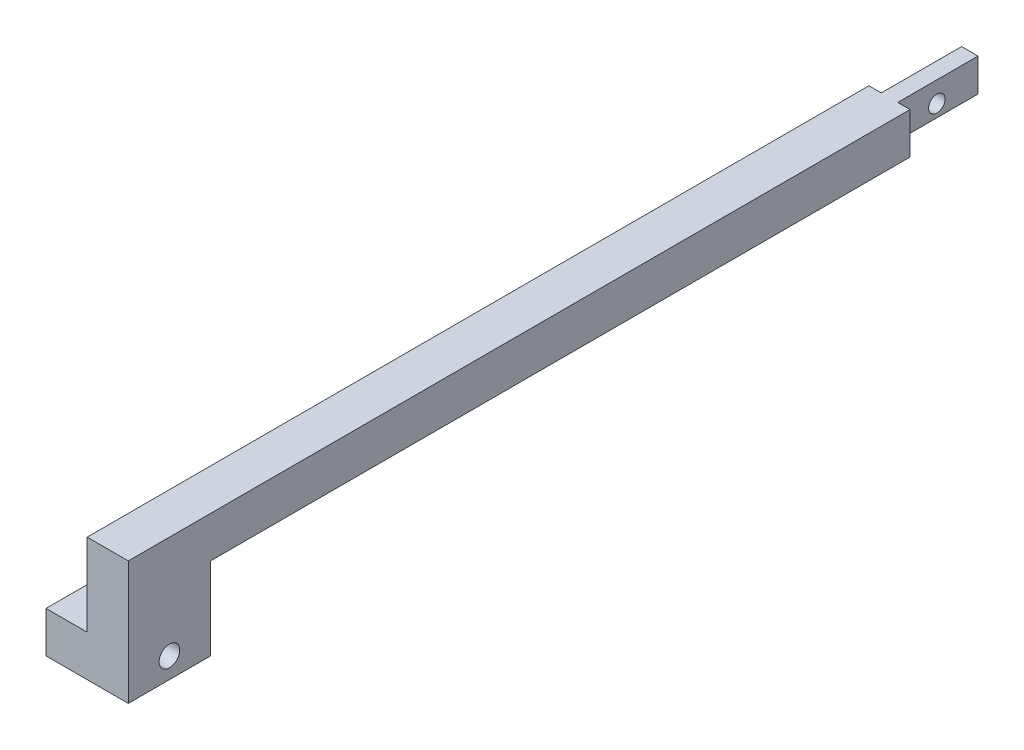
ISO-10303-21;
HEADER;
FILE_DESCRIPTION(('STEP AP214'),'2;1');
FILE_NAME('part.step','',(''),(''),'','','');
FILE_SCHEMA(('AUTOMOTIVE_DESIGN { 1 0 10303 214 1 1 1 1 }'));
ENDSEC;
DATA;
#1=APPLICATION_CONTEXT('core data for automotive mechanical design processes');
#2=APPLICATION_PROTOCOL_DEFINITION('international standard','automotive_design',2000,#1);
#3=PRODUCT_CONTEXT('',#1,'mechanical');
#4=PRODUCT('Part','Part','',(#3));
#5=PRODUCT_RELATED_PRODUCT_CATEGORY('part','',(#4));
#6=PRODUCT_DEFINITION_FORMATION('','',#4);
#7=PRODUCT_DEFINITION_CONTEXT('part definition',#1,'design');
#8=PRODUCT_DEFINITION('design','',#6,#7);
#9=PRODUCT_DEFINITION_SHAPE('','',#8);
#10=(LENGTH_UNIT() NAMED_UNIT(*) SI_UNIT(.MILLI.,.METRE.));
#11=(NAMED_UNIT(*) PLANE_ANGLE_UNIT() SI_UNIT($,.RADIAN.));
#12=(NAMED_UNIT(*) SI_UNIT($,.STERADIAN.) SOLID_ANGLE_UNIT());
#13=UNCERTAINTY_MEASURE_WITH_UNIT(LENGTH_MEASURE(1.E-05),#10,'distance_accuracy_value','');
#14=(GEOMETRIC_REPRESENTATION_CONTEXT(3) GLOBAL_UNCERTAINTY_ASSIGNED_CONTEXT((#13)) GLOBAL_UNIT_ASSIGNED_CONTEXT((#10,
#11,#12)) REPRESENTATION_CONTEXT('',''));
#15=CARTESIAN_POINT('',(0.,0.,0.));
#16=DIRECTION('',(0.,0.,1.));
#17=DIRECTION('',(1.,0.,0.));
#18=AXIS2_PLACEMENT_3D('',#15,#16,#17);
#19=CARTESIAN_POINT('',(0.,0.,0.));
#20=DIRECTION('',(0.,0.,-1.));
#21=DIRECTION('',(-1.,0.,0.));
#22=AXIS2_PLACEMENT_3D('',#19,#20,#21);
#23=PLANE('',#22);
#24=DIRECTION('',(0.,1.,0.));
#25=VECTOR('',#24,1.);
#26=CARTESIAN_POINT('',(13.,30.,0.));
#27=LINE('',#26,#25);
#28=CARTESIAN_POINT('',(13.,22.,0.));
#29=VERTEX_POINT('',#28);
#30=CARTESIAN_POINT('',(13.,30.,0.));
#31=VERTEX_POINT('',#30);
#32=EDGE_CURVE('E161',#29,#31,#27,.T.);
#33=ORIENTED_EDGE('',*,*,#32,.F.);
#34=DIRECTION('',(-1.,0.,0.));
#35=VECTOR('',#34,1.);
#36=CARTESIAN_POINT('',(13.,22.,0.));
#37=LINE('',#36,#35);
#38=CARTESIAN_POINT('',(17.,22.,0.));
#39=VERTEX_POINT('',#38);
#40=EDGE_CURVE('E151',#39,#29,#37,.T.);
#41=ORIENTED_EDGE('',*,*,#40,.F.);
#42=DIRECTION('',(0.,-1.,0.));
#43=VECTOR('',#42,1.);
#44=CARTESIAN_POINT('',(17.,30.,0.));
#45=LINE('',#44,#43);
#46=CARTESIAN_POINT('',(17.,30.,0.));
#47=VERTEX_POINT('',#46);
#48=EDGE_CURVE('E61',#47,#39,#45,.T.);
#49=ORIENTED_EDGE('',*,*,#48,.F.);
#50=DIRECTION('',(-1.,0.,0.));
#51=VECTOR('',#50,1.);
#52=CARTESIAN_POINT('',(10.,30.,0.));
#53=LINE('',#52,#51);
#54=CARTESIAN_POINT('',(20.,30.,0.));
#55=VERTEX_POINT('',#54);
#56=EDGE_CURVE('E206',#55,#47,#53,.T.);
#57=ORIENTED_EDGE('',*,*,#56,.F.);
#58=DIRECTION('',(0.,1.,0.));
#59=VECTOR('',#58,1.);
#60=CARTESIAN_POINT('',(20.,30.,0.));
#61=LINE('',#60,#59);
#62=CARTESIAN_POINT('',(20.,20.,0.));
#63=VERTEX_POINT('',#62);
#64=EDGE_CURVE('E189',#63,#55,#61,.T.);
#65=ORIENTED_EDGE('',*,*,#64,.F.);
#66=DIRECTION('',(1.,0.,0.));
#67=VECTOR('',#66,1.);
#68=CARTESIAN_POINT('',(0.,20.,0.));
#69=LINE('',#68,#67);
#70=CARTESIAN_POINT('',(10.,20.,0.));
#71=VERTEX_POINT('',#70);
#72=EDGE_CURVE('E47',#71,#63,#69,.T.);
#73=ORIENTED_EDGE('',*,*,#72,.F.);
#74=DIRECTION('',(0.,-1.,0.));
#75=VECTOR('',#74,1.);
#76=CARTESIAN_POINT('',(10.,10.,0.));
#77=LINE('',#76,#75);
#78=CARTESIAN_POINT('',(10.,30.,0.));
#79=VERTEX_POINT('',#78);
#80=EDGE_CURVE('E194',#79,#71,#77,.T.);
#81=ORIENTED_EDGE('',*,*,#80,.F.);
#82=EDGE_CURVE('E54',#31,#79,#53,.T.);
#83=ORIENTED_EDGE('',*,*,#82,.F.);
#84=EDGE_LOOP('',(#33,#41,#49,#57,#65,#73,#81,#83));
#85=FACE_BOUND('',#84,.T.);
#86=ADVANCED_FACE('F39',(#85),#23,.T.);
#87=CARTESIAN_POINT('',(20.,0.,190.));
#88=DIRECTION('',(0.,1.,0.));
#89=DIRECTION('',(-1.,0.,0.));
#90=AXIS2_PLACEMENT_3D('',#87,#88,#89);
#91=PLANE('',#90);
#92=DIRECTION('',(0.,0.,-1.));
#93=VECTOR('',#92,1.);
#94=CARTESIAN_POINT('',(0.,0.,190.));
#95=LINE('',#94,#93);
#96=CARTESIAN_POINT('',(0.,0.,190.));
#97=VERTEX_POINT('',#96);
#98=CARTESIAN_POINT('',(0.,0.,170.));
#99=VERTEX_POINT('',#98);
#100=EDGE_CURVE('E204',#97,#99,#95,.T.);
#101=ORIENTED_EDGE('',*,*,#100,.T.);
#102=DIRECTION('',(1.,0.,0.));
#103=VECTOR('',#102,1.);
#104=CARTESIAN_POINT('',(-170.,0.,170.));
#105=LINE('',#104,#103);
#106=CARTESIAN_POINT('',(20.,0.,170.));
#107=VERTEX_POINT('',#106);
#108=EDGE_CURVE('E175',#99,#107,#105,.T.);
#109=ORIENTED_EDGE('',*,*,#108,.T.);
#110=DIRECTION('',(0.,0.,-1.));
#111=VECTOR('',#110,1.);
#112=CARTESIAN_POINT('',(20.,0.,190.));
#113=LINE('',#112,#111);
#114=CARTESIAN_POINT('',(20.,0.,190.));
#115=VERTEX_POINT('',#114);
#116=EDGE_CURVE('E224',#115,#107,#113,.T.);
#117=ORIENTED_EDGE('',*,*,#116,.F.);
#118=DIRECTION('',(1.,0.,0.));
#119=VECTOR('',#118,1.);
#120=CARTESIAN_POINT('',(20.,0.,190.));
#121=LINE('',#120,#119);
#122=EDGE_CURVE('E190',#97,#115,#121,.T.);
#123=ORIENTED_EDGE('',*,*,#122,.F.);
#124=EDGE_LOOP('',(#101,#109,#117,#123));
#125=FACE_BOUND('',#124,.T.);
#126=ADVANCED_FACE('F41',(#125),#91,.F.);
#127=CARTESIAN_POINT('',(20.,30.,190.));
#128=DIRECTION('',(-1.,0.,0.));
#129=DIRECTION('',(0.,-1.,0.));
#130=AXIS2_PLACEMENT_3D('',#127,#128,#129);
#131=PLANE('',#130);
#132=CARTESIAN_POINT('',(20.,5.,180.));
#133=DIRECTION('',(-1.,0.,0.));
#134=DIRECTION('',(0.,0.,1.));
#135=AXIS2_PLACEMENT_3D('',#132,#133,#134);
#136=CIRCLE('',#135,2.49999999999999);
#137=CARTESIAN_POINT('',(20.,5.,182.5));
#138=VERTEX_POINT('',#137);
#139=EDGE_CURVE('E155',#138,#138,#136,.T.);
#140=ORIENTED_EDGE('',*,*,#139,.T.);
#141=EDGE_LOOP('',(#140));
#142=FACE_BOUND('',#141,.T.);
#143=ORIENTED_EDGE('',*,*,#116,.T.);
#144=DIRECTION('',(0.,-1.,0.));
#145=VECTOR('',#144,1.);
#146=CARTESIAN_POINT('',(20.,20.,170.));
#147=LINE('',#146,#145);
#148=CARTESIAN_POINT('',(20.,20.,170.));
#149=VERTEX_POINT('',#148);
#150=EDGE_CURVE('E170',#149,#107,#147,.T.);
#151=ORIENTED_EDGE('',*,*,#150,.F.);
#152=DIRECTION('',(0.,0.,1.));
#153=VECTOR('',#152,1.);
#154=CARTESIAN_POINT('',(20.,20.,170.));
#155=LINE('',#154,#153);
#156=EDGE_CURVE('E172',#63,#149,#155,.T.);
#157=ORIENTED_EDGE('',*,*,#156,.F.);
#158=ORIENTED_EDGE('',*,*,#64,.T.);
#159=DIRECTION('',(0.,0.,-1.));
#160=VECTOR('',#159,1.);
#161=CARTESIAN_POINT('',(20.,30.,190.));
#162=LINE('',#161,#160);
#163=CARTESIAN_POINT('',(20.,30.,190.));
#164=VERTEX_POINT('',#163);
#165=EDGE_CURVE('E221',#164,#55,#162,.T.);
#166=ORIENTED_EDGE('',*,*,#165,.F.);
#167=DIRECTION('',(0.,1.,0.));
#168=VECTOR('',#167,1.);
#169=CARTESIAN_POINT('',(20.,30.,190.));
#170=LINE('',#169,#168);
#171=EDGE_CURVE('E193',#115,#164,#170,.T.);
#172=ORIENTED_EDGE('',*,*,#171,.F.);
#173=EDGE_LOOP('',(#143,#151,#157,#158,#166,#172));
#174=FACE_BOUND('',#173,.T.);
#175=ADVANCED_FACE('F234',(#142,#174),#131,.F.);
#176=CARTESIAN_POINT('',(10.,30.,190.));
#177=DIRECTION('',(0.,-1.,0.));
#178=DIRECTION('',(0.,0.,-1.));
#179=AXIS2_PLACEMENT_3D('',#176,#177,#178);
#180=PLANE('',#179);
#181=ORIENTED_EDGE('',*,*,#56,.T.);
#182=DIRECTION('',(0.,0.,1.));
#183=VECTOR('',#182,1.);
#184=CARTESIAN_POINT('',(17.,30.,-19.5));
#185=LINE('',#184,#183);
#186=CARTESIAN_POINT('',(17.,30.,-19.5));
#187=VERTEX_POINT('',#186);
#188=EDGE_CURVE('E164',#187,#47,#185,.T.);
#189=ORIENTED_EDGE('',*,*,#188,.F.);
#190=DIRECTION('',(1.,0.,0.));
#191=VECTOR('',#190,1.);
#192=CARTESIAN_POINT('',(17.,30.,-19.5));
#193=LINE('',#192,#191);
#194=CARTESIAN_POINT('',(13.,30.,-19.5));
#195=VERTEX_POINT('',#194);
#196=EDGE_CURVE('E137',#195,#187,#193,.T.);
#197=ORIENTED_EDGE('',*,*,#196,.F.);
#198=DIRECTION('',(0.,0.,1.));
#199=VECTOR('',#198,1.);
#200=CARTESIAN_POINT('',(13.,30.,-19.5));
#201=LINE('',#200,#199);
#202=EDGE_CURVE('E134',#195,#31,#201,.T.);
#203=ORIENTED_EDGE('',*,*,#202,.T.);
#204=ORIENTED_EDGE('',*,*,#82,.T.);
#205=DIRECTION('',(0.,0.,-1.));
#206=VECTOR('',#205,1.);
#207=CARTESIAN_POINT('',(10.,30.,190.));
#208=LINE('',#207,#206);
#209=CARTESIAN_POINT('',(10.,30.,190.));
#210=VERTEX_POINT('',#209);
#211=EDGE_CURVE('E218',#210,#79,#208,.T.);
#212=ORIENTED_EDGE('',*,*,#211,.F.);
#213=DIRECTION('',(-1.,0.,0.));
#214=VECTOR('',#213,1.);
#215=CARTESIAN_POINT('',(10.,30.,190.));
#216=LINE('',#215,#214);
#217=EDGE_CURVE('E196',#164,#210,#216,.T.);
#218=ORIENTED_EDGE('',*,*,#217,.F.);
#219=ORIENTED_EDGE('',*,*,#165,.T.);
#220=EDGE_LOOP('',(#181,#189,#197,#203,#204,#212,#218,#219));
#221=FACE_BOUND('',#220,.T.);
#222=ADVANCED_FACE('F238',(#221),#180,.F.);
#223=CARTESIAN_POINT('',(10.,10.,190.));
#224=DIRECTION('',(1.,0.,0.));
#225=DIRECTION('',(0.,0.,-1.));
#226=AXIS2_PLACEMENT_3D('',#223,#224,#225);
#227=PLANE('',#226);
#228=DIRECTION('',(0.,0.,1.));
#229=VECTOR('',#228,1.);
#230=CARTESIAN_POINT('',(10.,20.,190.));
#231=LINE('',#230,#229);
#232=CARTESIAN_POINT('',(10.,20.,170.));
#233=VERTEX_POINT('',#232);
#234=EDGE_CURVE('E178',#71,#233,#231,.T.);
#235=ORIENTED_EDGE('',*,*,#234,.T.);
#236=DIRECTION('',(0.,-1.,0.));
#237=VECTOR('',#236,1.);
#238=CARTESIAN_POINT('',(10.,10.,170.));
#239=LINE('',#238,#237);
#240=CARTESIAN_POINT('',(10.,10.,170.));
#241=VERTEX_POINT('',#240);
#242=EDGE_CURVE('E186',#233,#241,#239,.T.);
#243=ORIENTED_EDGE('',*,*,#242,.T.);
#244=DIRECTION('',(0.,0.,-1.));
#245=VECTOR('',#244,1.);
#246=CARTESIAN_POINT('',(10.,10.,190.));
#247=LINE('',#246,#245);
#248=CARTESIAN_POINT('',(10.,10.,190.));
#249=VERTEX_POINT('',#248);
#250=EDGE_CURVE('E215',#249,#241,#247,.T.);
#251=ORIENTED_EDGE('',*,*,#250,.F.);
#252=DIRECTION('',(0.,-1.,0.));
#253=VECTOR('',#252,1.);
#254=CARTESIAN_POINT('',(10.,10.,190.));
#255=LINE('',#254,#253);
#256=EDGE_CURVE('E198',#210,#249,#255,.T.);
#257=ORIENTED_EDGE('',*,*,#256,.F.);
#258=ORIENTED_EDGE('',*,*,#211,.T.);
#259=ORIENTED_EDGE('',*,*,#80,.T.);
#260=EDGE_LOOP('',(#235,#243,#251,#257,#258,#259));
#261=FACE_BOUND('',#260,.T.);
#262=ADVANCED_FACE('F245',(#261),#227,.F.);
#263=CARTESIAN_POINT('',(0.,10.,190.));
#264=DIRECTION('',(0.,-1.,0.));
#265=DIRECTION('',(0.,0.,-1.));
#266=AXIS2_PLACEMENT_3D('',#263,#264,#265);
#267=PLANE('',#266);
#268=ORIENTED_EDGE('',*,*,#250,.T.);
#269=DIRECTION('',(-1.,0.,0.));
#270=VECTOR('',#269,1.);
#271=CARTESIAN_POINT('',(0.,10.,170.));
#272=LINE('',#271,#270);
#273=CARTESIAN_POINT('',(0.,10.,170.));
#274=VERTEX_POINT('',#273);
#275=EDGE_CURVE('E183',#241,#274,#272,.T.);
#276=ORIENTED_EDGE('',*,*,#275,.T.);
#277=DIRECTION('',(0.,0.,-1.));
#278=VECTOR('',#277,1.);
#279=CARTESIAN_POINT('',(0.,10.,190.));
#280=LINE('',#279,#278);
#281=CARTESIAN_POINT('',(0.,10.,190.));
#282=VERTEX_POINT('',#281);
#283=EDGE_CURVE('E212',#282,#274,#280,.T.);
#284=ORIENTED_EDGE('',*,*,#283,.F.);
#285=DIRECTION('',(-1.,0.,0.));
#286=VECTOR('',#285,1.);
#287=CARTESIAN_POINT('',(0.,10.,190.));
#288=LINE('',#287,#286);
#289=EDGE_CURVE('E200',#249,#282,#288,.T.);
#290=ORIENTED_EDGE('',*,*,#289,.F.);
#291=EDGE_LOOP('',(#268,#276,#284,#290));
#292=FACE_BOUND('',#291,.T.);
#293=ADVANCED_FACE('F262',(#292),#267,.F.);
#294=CARTESIAN_POINT('',(0.,0.,190.));
#295=DIRECTION('',(1.,0.,0.));
#296=DIRECTION('',(0.,0.,-1.));
#297=AXIS2_PLACEMENT_3D('',#294,#295,#296);
#298=PLANE('',#297);
#299=ORIENTED_EDGE('',*,*,#283,.T.);
#300=DIRECTION('',(0.,-1.,0.));
#301=VECTOR('',#300,1.);
#302=CARTESIAN_POINT('',(0.,0.,170.));
#303=LINE('',#302,#301);
#304=EDGE_CURVE('E11',#274,#99,#303,.T.);
#305=ORIENTED_EDGE('',*,*,#304,.T.);
#306=ORIENTED_EDGE('',*,*,#100,.F.);
#307=DIRECTION('',(0.,-1.,0.));
#308=VECTOR('',#307,1.);
#309=CARTESIAN_POINT('',(0.,0.,190.));
#310=LINE('',#309,#308);
#311=EDGE_CURVE('E202',#282,#97,#310,.T.);
#312=ORIENTED_EDGE('',*,*,#311,.F.);
#313=EDGE_LOOP('',(#299,#305,#306,#312));
#314=FACE_BOUND('',#313,.T.);
#315=CARTESIAN_POINT('',(0.,5.,180.));
#316=DIRECTION('',(-1.,0.,0.));
#317=DIRECTION('',(0.,0.,1.));
#318=AXIS2_PLACEMENT_3D('',#315,#316,#317);
#319=CIRCLE('',#318,2.5);
#320=CARTESIAN_POINT('',(0.,5.,182.5));
#321=VERTEX_POINT('',#320);
#322=EDGE_CURVE('E152',#321,#321,#319,.T.);
#323=ORIENTED_EDGE('',*,*,#322,.F.);
#324=EDGE_LOOP('',(#323));
#325=FACE_BOUND('',#324,.T.);
#326=ADVANCED_FACE('F258',(#314,#325),#298,.F.);
#327=CARTESIAN_POINT('',(0.,0.,190.));
#328=DIRECTION('',(0.,0.,-1.));
#329=DIRECTION('',(-1.,0.,0.));
#330=AXIS2_PLACEMENT_3D('',#327,#328,#329);
#331=PLANE('',#330);
#332=ORIENTED_EDGE('',*,*,#122,.T.);
#333=ORIENTED_EDGE('',*,*,#171,.T.);
#334=ORIENTED_EDGE('',*,*,#217,.T.);
#335=ORIENTED_EDGE('',*,*,#256,.T.);
#336=ORIENTED_EDGE('',*,*,#289,.T.);
#337=ORIENTED_EDGE('',*,*,#311,.T.);
#338=EDGE_LOOP('',(#332,#333,#334,#335,#336,#337));
#339=FACE_BOUND('',#338,.T.);
#340=ADVANCED_FACE('F249',(#339),#331,.F.);
#341=CARTESIAN_POINT('',(-170.,20.,170.));
#342=DIRECTION('',(0.,0.,1.));
#343=DIRECTION('',(1.,0.,0.));
#344=AXIS2_PLACEMENT_3D('',#341,#342,#343);
#345=PLANE('',#344);
#346=DIRECTION('',(1.,0.,0.));
#347=VECTOR('',#346,1.);
#348=CARTESIAN_POINT('',(-170.,20.,170.));
#349=LINE('',#348,#347);
#350=EDGE_CURVE('E176',#233,#149,#349,.T.);
#351=ORIENTED_EDGE('',*,*,#350,.T.);
#352=ORIENTED_EDGE('',*,*,#150,.T.);
#353=ORIENTED_EDGE('',*,*,#108,.F.);
#354=ORIENTED_EDGE('',*,*,#304,.F.);
#355=ORIENTED_EDGE('',*,*,#275,.F.);
#356=ORIENTED_EDGE('',*,*,#242,.F.);
#357=EDGE_LOOP('',(#351,#352,#353,#354,#355,#356));
#358=FACE_BOUND('',#357,.T.);
#359=ADVANCED_FACE('F256',(#358),#345,.F.);
#360=CARTESIAN_POINT('',(-170.,20.,170.));
#361=DIRECTION('',(0.,1.,0.));
#362=DIRECTION('',(-1.,0.,0.));
#363=AXIS2_PLACEMENT_3D('',#360,#361,#362);
#364=PLANE('',#363);
#365=ORIENTED_EDGE('',*,*,#72,.T.);
#366=ORIENTED_EDGE('',*,*,#156,.T.);
#367=ORIENTED_EDGE('',*,*,#350,.F.);
#368=ORIENTED_EDGE('',*,*,#234,.F.);
#369=EDGE_LOOP('',(#365,#366,#367,#368));
#370=FACE_BOUND('',#369,.T.);
#371=ADVANCED_FACE('F229',(#370),#364,.F.);
#372=CARTESIAN_POINT('',(17.,30.,-19.5));
#373=DIRECTION('',(-1.,0.,0.));
#374=DIRECTION('',(0.,0.,1.));
#375=AXIS2_PLACEMENT_3D('',#372,#373,#374);
#376=PLANE('',#375);
#377=CARTESIAN_POINT('',(17.,25.,-9.5));
#378=DIRECTION('',(-1.,0.,0.));
#379=DIRECTION('',(0.,0.,1.));
#380=AXIS2_PLACEMENT_3D('',#377,#378,#379);
#381=CIRCLE('',#380,2.);
#382=CARTESIAN_POINT('',(17.,25.,-7.5));
#383=VERTEX_POINT('',#382);
#384=EDGE_CURVE('E310',#383,#383,#381,.T.);
#385=ORIENTED_EDGE('',*,*,#384,.T.);
#386=EDGE_LOOP('',(#385));
#387=FACE_BOUND('',#386,.T.);
#388=ORIENTED_EDGE('',*,*,#48,.T.);
#389=DIRECTION('',(0.,0.,1.));
#390=VECTOR('',#389,1.);
#391=CARTESIAN_POINT('',(17.,22.,0.));
#392=LINE('',#391,#390);
#393=CARTESIAN_POINT('',(17.,22.,-19.5));
#394=VERTEX_POINT('',#393);
#395=EDGE_CURVE('E147',#394,#39,#392,.T.);
#396=ORIENTED_EDGE('',*,*,#395,.F.);
#397=DIRECTION('',(0.,-1.,0.));
#398=VECTOR('',#397,1.);
#399=CARTESIAN_POINT('',(17.,30.,-19.5));
#400=LINE('',#399,#398);
#401=EDGE_CURVE('E138',#187,#394,#400,.T.);
#402=ORIENTED_EDGE('',*,*,#401,.F.);
#403=ORIENTED_EDGE('',*,*,#188,.T.);
#404=EDGE_LOOP('',(#388,#396,#402,#403));
#405=FACE_BOUND('',#404,.T.);
#406=ADVANCED_FACE('F241',(#387,#405),#376,.F.);
#407=CARTESIAN_POINT('',(13.,30.,-19.5));
#408=DIRECTION('',(1.,0.,0.));
#409=DIRECTION('',(0.,0.,-1.));
#410=AXIS2_PLACEMENT_3D('',#407,#408,#409);
#411=PLANE('',#410);
#412=CARTESIAN_POINT('',(13.,25.,-9.5));
#413=DIRECTION('',(-1.,0.,0.));
#414=DIRECTION('',(0.,0.,1.));
#415=AXIS2_PLACEMENT_3D('',#412,#413,#414);
#416=CIRCLE('',#415,2.);
#417=CARTESIAN_POINT('',(13.,25.,-7.5));
#418=VERTEX_POINT('',#417);
#419=EDGE_CURVE('E307',#418,#418,#416,.T.);
#420=ORIENTED_EDGE('',*,*,#419,.F.);
#421=EDGE_LOOP('',(#420));
#422=FACE_BOUND('',#421,.T.);
#423=ORIENTED_EDGE('',*,*,#32,.T.);
#424=ORIENTED_EDGE('',*,*,#202,.F.);
#425=DIRECTION('',(0.,1.,0.));
#426=VECTOR('',#425,1.);
#427=CARTESIAN_POINT('',(13.,30.,-19.5));
#428=LINE('',#427,#426);
#429=CARTESIAN_POINT('',(13.,22.,-19.5));
#430=VERTEX_POINT('',#429);
#431=EDGE_CURVE('E128',#430,#195,#428,.T.);
#432=ORIENTED_EDGE('',*,*,#431,.F.);
#433=DIRECTION('',(0.,0.,-1.));
#434=VECTOR('',#433,1.);
#435=CARTESIAN_POINT('',(13.,22.,0.));
#436=LINE('',#435,#434);
#437=EDGE_CURVE('E132',#29,#430,#436,.T.);
#438=ORIENTED_EDGE('',*,*,#437,.F.);
#439=EDGE_LOOP('',(#423,#424,#432,#438));
#440=FACE_BOUND('',#439,.T.);
#441=ADVANCED_FACE('F130',(#422,#440),#411,.F.);
#442=CARTESIAN_POINT('',(0.,0.,-19.5));
#443=DIRECTION('',(0.,0.,-1.));
#444=DIRECTION('',(-1.,0.,0.));
#445=AXIS2_PLACEMENT_3D('',#442,#443,#444);
#446=PLANE('',#445);
#447=ORIENTED_EDGE('',*,*,#401,.T.);
#448=DIRECTION('',(1.,0.,0.));
#449=VECTOR('',#448,1.);
#450=CARTESIAN_POINT('',(13.,22.,-19.5));
#451=LINE('',#450,#449);
#452=EDGE_CURVE('E141',#430,#394,#451,.T.);
#453=ORIENTED_EDGE('',*,*,#452,.F.);
#454=ORIENTED_EDGE('',*,*,#431,.T.);
#455=ORIENTED_EDGE('',*,*,#196,.T.);
#456=EDGE_LOOP('',(#447,#453,#454,#455));
#457=FACE_BOUND('',#456,.T.);
#458=ADVANCED_FACE('F142',(#457),#446,.T.);
#459=CARTESIAN_POINT('',(0.,22.,0.));
#460=DIRECTION('',(0.,-1.,0.));
#461=DIRECTION('',(0.,0.,-1.));
#462=AXIS2_PLACEMENT_3D('',#459,#460,#461);
#463=PLANE('',#462);
#464=ORIENTED_EDGE('',*,*,#437,.T.);
#465=ORIENTED_EDGE('',*,*,#452,.T.);
#466=ORIENTED_EDGE('',*,*,#395,.T.);
#467=ORIENTED_EDGE('',*,*,#40,.T.);
#468=EDGE_LOOP('',(#464,#465,#466,#467));
#469=FACE_BOUND('',#468,.T.);
#470=ADVANCED_FACE('F150',(#469),#463,.T.);
#471=CARTESIAN_POINT('',(20.,5.,180.));
#472=DIRECTION('',(-1.,0.,0.));
#473=DIRECTION('',(0.,0.,1.));
#474=AXIS2_PLACEMENT_3D('',#471,#472,#473);
#475=CYLINDRICAL_SURFACE('',#474,2.5);
#476=ORIENTED_EDGE('',*,*,#322,.T.);
#477=EDGE_LOOP('',(#476));
#478=FACE_BOUND('',#477,.T.);
#479=ORIENTED_EDGE('',*,*,#139,.F.);
#480=EDGE_LOOP('',(#479));
#481=FACE_BOUND('',#480,.T.);
#482=ADVANCED_FACE('F295',(#478,#481),#475,.F.);
#483=CARTESIAN_POINT('',(20.,25.,-9.5));
#484=DIRECTION('',(-1.,0.,0.));
#485=DIRECTION('',(0.,0.,1.));
#486=AXIS2_PLACEMENT_3D('',#483,#484,#485);
#487=CYLINDRICAL_SURFACE('',#486,2.);
#488=CARTESIAN_POINT('',(13.,25.,-7.5));
#489=CARTESIAN_POINT('',(13.0416666666667,25.,-7.5));
#490=CARTESIAN_POINT('',(13.0833333333333,25.,-7.5));
#491=CARTESIAN_POINT('',(13.1666666666667,25.,-7.5));
#492=CARTESIAN_POINT('',(13.2083333333333,25.,-7.5));
#493=CARTESIAN_POINT('',(13.2916666666667,25.,-7.5));
#494=CARTESIAN_POINT('',(13.3333333333333,25.,-7.5));
#495=CARTESIAN_POINT('',(13.4166666666667,25.,-7.5));
#496=CARTESIAN_POINT('',(13.4583333333333,25.,-7.5));
#497=CARTESIAN_POINT('',(13.5416666666667,25.,-7.5));
#498=CARTESIAN_POINT('',(13.5833333333333,25.,-7.5));
#499=CARTESIAN_POINT('',(13.6666666666667,25.,-7.5));
#500=CARTESIAN_POINT('',(13.7083333333333,25.,-7.5));
#501=CARTESIAN_POINT('',(13.7916666666667,25.,-7.5));
#502=CARTESIAN_POINT('',(13.8333333333333,25.,-7.5));
#503=CARTESIAN_POINT('',(13.9166666666667,25.,-7.5));
#504=CARTESIAN_POINT('',(13.9583333333333,25.,-7.5));
#505=CARTESIAN_POINT('',(14.0416666666667,25.,-7.5));
#506=CARTESIAN_POINT('',(14.0833333333333,25.,-7.5));
#507=CARTESIAN_POINT('',(14.1666666666667,25.,-7.5));
#508=CARTESIAN_POINT('',(14.2083333333333,25.,-7.5));
#509=CARTESIAN_POINT('',(14.2916666666667,25.,-7.5));
#510=CARTESIAN_POINT('',(14.3333333333333,25.,-7.5));
#511=CARTESIAN_POINT('',(14.4166666666667,25.,-7.5));
#512=CARTESIAN_POINT('',(14.4583333333333,25.,-7.5));
#513=CARTESIAN_POINT('',(14.5416666666667,25.,-7.5));
#514=CARTESIAN_POINT('',(14.5833333333333,25.,-7.5));
#515=CARTESIAN_POINT('',(14.6666666666667,25.,-7.5));
#516=CARTESIAN_POINT('',(14.7083333333333,25.,-7.5));
#517=CARTESIAN_POINT('',(14.7916666666667,25.,-7.5));
#518=CARTESIAN_POINT('',(14.8333333333333,25.,-7.5));
#519=CARTESIAN_POINT('',(14.9166666666667,25.,-7.5));
#520=CARTESIAN_POINT('',(14.9583333333333,25.,-7.5));
#521=CARTESIAN_POINT('',(15.0416666666667,25.,-7.5));
#522=CARTESIAN_POINT('',(15.0833333333333,25.,-7.5));
#523=CARTESIAN_POINT('',(15.1666666666667,25.,-7.5));
#524=CARTESIAN_POINT('',(15.2083333333333,25.,-7.5));
#525=CARTESIAN_POINT('',(15.2916666666667,25.,-7.5));
#526=CARTESIAN_POINT('',(15.3333333333333,25.,-7.5));
#527=CARTESIAN_POINT('',(15.4166666666667,25.,-7.5));
#528=CARTESIAN_POINT('',(15.4583333333333,25.,-7.5));
#529=CARTESIAN_POINT('',(15.5416666666667,25.,-7.5));
#530=CARTESIAN_POINT('',(15.5833333333333,25.,-7.5));
#531=CARTESIAN_POINT('',(15.6666666666667,25.,-7.5));
#532=CARTESIAN_POINT('',(15.7083333333333,25.,-7.5));
#533=CARTESIAN_POINT('',(15.7916666666667,25.,-7.5));
#534=CARTESIAN_POINT('',(15.8333333333333,25.,-7.5));
#535=CARTESIAN_POINT('',(15.9166666666667,25.,-7.5));
#536=CARTESIAN_POINT('',(15.9583333333333,25.,-7.5));
#537=CARTESIAN_POINT('',(16.0416666666667,25.,-7.5));
#538=CARTESIAN_POINT('',(16.0833333333333,25.,-7.5));
#539=CARTESIAN_POINT('',(16.1666666666667,25.,-7.5));
#540=CARTESIAN_POINT('',(16.2083333333333,25.,-7.5));
#541=CARTESIAN_POINT('',(16.2916666666667,25.,-7.5));
#542=CARTESIAN_POINT('',(16.3333333333333,25.,-7.5));
#543=CARTESIAN_POINT('',(16.4166666666667,25.,-7.5));
#544=CARTESIAN_POINT('',(16.4583333333333,25.,-7.5));
#545=CARTESIAN_POINT('',(16.5416666666667,25.,-7.5));
#546=CARTESIAN_POINT('',(16.5833333333333,25.,-7.5));
#547=CARTESIAN_POINT('',(16.6666666666667,25.,-7.5));
#548=CARTESIAN_POINT('',(16.7083333333333,25.,-7.5));
#549=CARTESIAN_POINT('',(16.7916666666667,25.,-7.5));
#550=CARTESIAN_POINT('',(16.8333333333333,25.,-7.5));
#551=CARTESIAN_POINT('',(16.9166666666667,25.,-7.5));
#552=CARTESIAN_POINT('',(16.9583333333333,25.,-7.5));
#553=CARTESIAN_POINT('',(17.,25.,-7.5));
#554=B_SPLINE_CURVE_WITH_KNOTS('',3,(#488,#489,#490,#491,#492,#493,#494,#495,#496,#497,#498,
#499,#500,#501,#502,#503,#504,#505,#506,#507,#508,#509,#510,#511,#512,#513,#514,#515,#516,#517,
#518,#519,#520,#521,#522,#523,#524,#525,#526,#527,#528,#529,#530,#531,#532,#533,#534,#535,#536,
#537,#538,#539,#540,#541,#542,#543,#544,#545,#546,#547,#548,#549,#550,#551,#552,#553),
.UNSPECIFIED.,.F.,.F.,(4,2,2,2,2,2,2,2,2,2,2,2,2,2,2,2,2,2,2,2,2,2,2,2,2,2,2,2,2,2,2,2,4),(0.,
0.125,0.25,0.375,0.5,0.625000000000001,0.750000000000001,0.875000000000001,1.,1.125,1.25,1.375,
1.5,1.625,1.75,1.875,2.,2.125,2.25,2.375,2.5,2.625,2.75,2.875,3.,3.125,3.25,3.375,3.5,3.625,
3.75,3.875,4.),.UNSPECIFIED.);
#555=EDGE_CURVE('BSEAM298',#418,#383,#554,.T.);
#556=ORIENTED_EDGE('',*,*,#419,.T.);
#557=ORIENTED_EDGE('',*,*,#384,.F.);
#558=ORIENTED_EDGE('',*,*,#555,.T.);
#559=ORIENTED_EDGE('',*,*,#555,.F.);
#560=EDGE_LOOP('',(#556,#558,#557,#559));
#561=FACE_BOUND('',#560,.T.);
#562=ADVANCED_FACE('F298',(#561),#487,.F.);
#563=CLOSED_SHELL('',(#86,#126,#175,#222,#262,#293,#326,#340,#359,#371,#406,#441,#458,#470,#482,#562));
#564=MANIFOLD_SOLID_BREP('B2',#563);
#565=ADVANCED_BREP_SHAPE_REPRESENTATION('',(#18,#564),#14);
#566=SHAPE_DEFINITION_REPRESENTATION(#9,#565);
ENDSEC;
END-ISO-10303-21;
